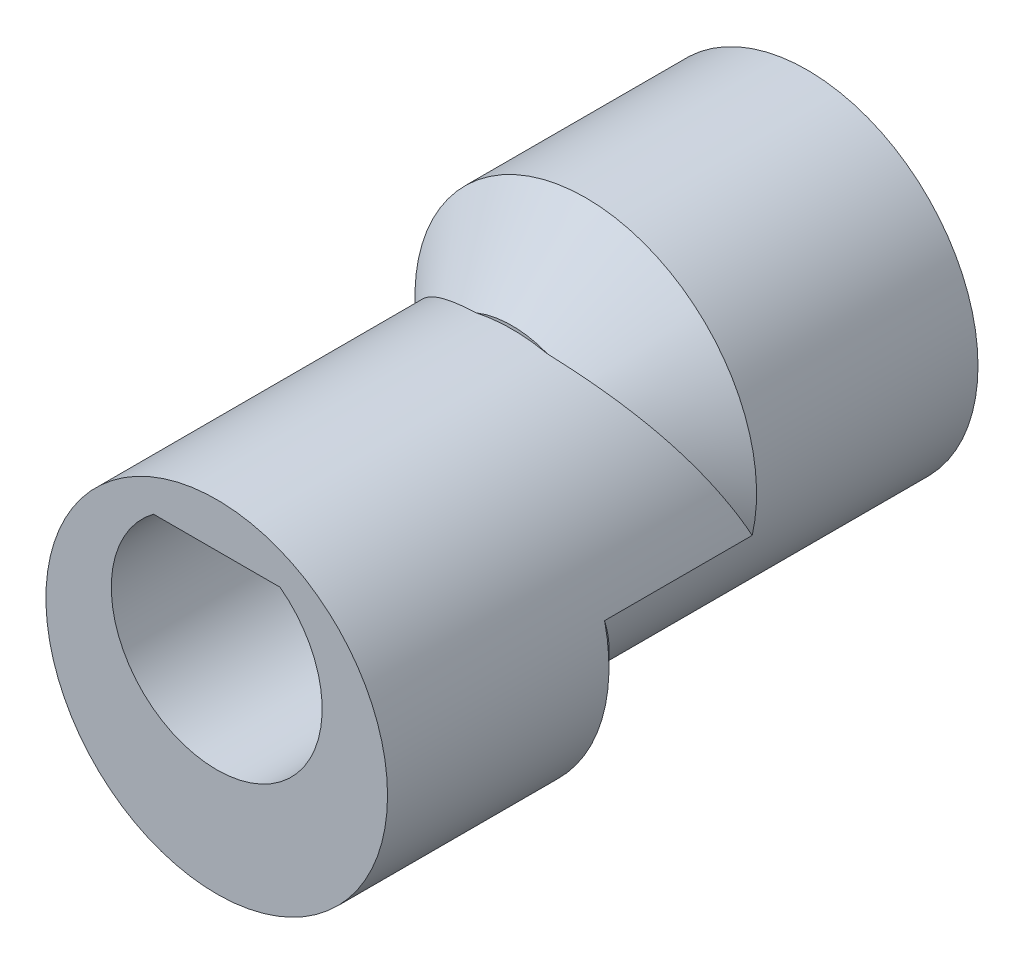
ISO-10303-21;
HEADER;
FILE_DESCRIPTION(('STEP AP214'),'2;1');
FILE_NAME('part.step','',(''),(''),'','','');
FILE_SCHEMA(('AUTOMOTIVE_DESIGN { 1 0 10303 214 1 1 1 1 }'));
ENDSEC;
DATA;
#1=APPLICATION_CONTEXT('core data for automotive mechanical design processes');
#2=APPLICATION_PROTOCOL_DEFINITION('international standard','automotive_design',2000,#1);
#3=PRODUCT_CONTEXT('',#1,'mechanical');
#4=PRODUCT('Part','Part','',(#3));
#5=PRODUCT_RELATED_PRODUCT_CATEGORY('part','',(#4));
#6=PRODUCT_DEFINITION_FORMATION('','',#4);
#7=PRODUCT_DEFINITION_CONTEXT('part definition',#1,'design');
#8=PRODUCT_DEFINITION('design','',#6,#7);
#9=PRODUCT_DEFINITION_SHAPE('','',#8);
#10=(LENGTH_UNIT() NAMED_UNIT(*) SI_UNIT(.MILLI.,.METRE.));
#11=(NAMED_UNIT(*) PLANE_ANGLE_UNIT() SI_UNIT($,.RADIAN.));
#12=(NAMED_UNIT(*) SI_UNIT($,.STERADIAN.) SOLID_ANGLE_UNIT());
#13=UNCERTAINTY_MEASURE_WITH_UNIT(LENGTH_MEASURE(1.E-05),#10,'distance_accuracy_value','');
#14=(GEOMETRIC_REPRESENTATION_CONTEXT(3) GLOBAL_UNCERTAINTY_ASSIGNED_CONTEXT((#13)) GLOBAL_UNIT_ASSIGNED_CONTEXT((#10,
#11,#12)) REPRESENTATION_CONTEXT('',''));
#15=CARTESIAN_POINT('',(0.,0.,0.));
#16=DIRECTION('',(0.,0.,1.));
#17=DIRECTION('',(1.,0.,0.));
#18=AXIS2_PLACEMENT_3D('',#15,#16,#17);
#19=CARTESIAN_POINT('',(0.,0.822072072072072,7.));
#20=DIRECTION('',(0.,0.,-1.));
#21=DIRECTION('',(-1.,0.,0.));
#22=AXIS2_PLACEMENT_3D('',#19,#20,#21);
#23=CYLINDRICAL_SURFACE('',#22,4.05);
#24=CARTESIAN_POINT('',(0.,0.822072072072072,7.));
#25=DIRECTION('',(0.,0.,1.));
#26=DIRECTION('',(1.,0.,0.));
#27=AXIS2_PLACEMENT_3D('',#24,#25,#26);
#28=CIRCLE('',#27,4.05);
#29=CARTESIAN_POINT('',(-0.846961969928471,-3.13837681934098,7.));
#30=VERTEX_POINT('',#29);
#31=CARTESIAN_POINT('',(0.846961969928471,-3.13837681934098,7.));
#32=VERTEX_POINT('',#31);
#33=EDGE_CURVE('E126',#30,#32,#28,.T.);
#34=ORIENTED_EDGE('',*,*,#33,.F.);
#35=CARTESIAN_POINT('',(-0.846961969928474,-3.13837681934098,7.));
#36=CARTESIAN_POINT('',(-0.944453761857588,-3.11753117747086,7.0165096973595));
#37=CARTESIAN_POINT('',(-1.04067496903015,-3.09318540551459,7.0356230191721));
#38=CARTESIAN_POINT('',(-1.23005837692651,-3.03787270431107,7.07838493619462));
#39=CARTESIAN_POINT('',(-1.32322355564702,-3.00691245596755,7.10202895274361));
#40=CARTESIAN_POINT('',(-1.59662952298076,-2.90498422423005,7.17852404267998));
#41=CARTESIAN_POINT('',(-1.77187682901298,-2.82472806223556,7.23713699648168));
#42=CARTESIAN_POINT('',(-2.11342415888718,-2.63848373698076,7.36760455331461));
#43=CARTESIAN_POINT('',(-2.27901457901958,-2.53153683436217,7.43992045799975));
#44=CARTESIAN_POINT('',(-2.59123932792963,-2.29661590900539,7.59193723018417));
#45=CARTESIAN_POINT('',(-2.73783425248497,-2.16859938915646,7.6716528781912));
#46=CARTESIAN_POINT('',(-3.03653680637737,-1.86775280591906,7.85116810696908));
#47=CARTESIAN_POINT('',(-3.18421083105399,-1.69104561302631,7.95186678230101));
#48=CARTESIAN_POINT('',(-3.44707875426469,-1.3162614680761,8.15549253682651));
#49=CARTESIAN_POINT('',(-3.56229295149296,-1.11819797878398,8.25841817982772));
#50=CARTESIAN_POINT('',(-3.72228939882795,-0.780496321625936,8.42649292580067));
#51=CARTESIAN_POINT('',(-3.77745627076403,-0.645751719150888,8.49179106287402));
#52=CARTESIAN_POINT('',(-3.87300271056816,-0.371020787102501,8.62159073903438));
#53=CARTESIAN_POINT('',(-3.91340419508013,-0.231042569178789,8.68609332033252));
#54=CARTESIAN_POINT('',(-3.94620239484035,-0.0889639639639639,8.75));
#55=B_SPLINE_CURVE_WITH_KNOTS('',3,(#35,#36,#37,#38,#39,#40,#41,#42,#43,#44,#45,#46,#47,#48,#49,
#50,#51,#52,#53,#54),.UNSPECIFIED.,.F.,.F.,(4,2,2,2,2,2,2,2,2,4),(0.,0.30292613976948,
0.605547745629666,1.20741367974593,1.83518085028585,2.46423009440399,3.21514113558015,
3.96558154828874,4.44358282871277,4.92087168989357),.UNSPECIFIED.);
#56=CARTESIAN_POINT('',(-3.94620239484035,-0.0889639639639638,8.75));
#57=VERTEX_POINT('',#56);
#58=EDGE_CURVE('E11',#30,#57,#55,.T.);
#59=ORIENTED_EDGE('',*,*,#58,.T.);
#60=DIRECTION('',(0.,0.,-1.));
#61=VECTOR('',#60,1.);
#62=CARTESIAN_POINT('',(-3.94620239484035,-0.0889639639639638,7.));
#63=LINE('',#62,#61);
#64=CARTESIAN_POINT('',(-3.94620239484035,-0.0889639639639638,5.24999999999999));
#65=VERTEX_POINT('',#64);
#66=EDGE_CURVE('E138',#57,#65,#63,.T.);
#67=ORIENTED_EDGE('',*,*,#66,.T.);
#68=CARTESIAN_POINT('',(0.,0.822072072072072,5.24999999999999));
#69=DIRECTION('',(0.,0.,1.));
#70=DIRECTION('',(1.,0.,0.));
#71=AXIS2_PLACEMENT_3D('',#68,#69,#70);
#72=CIRCLE('',#71,4.05);
#73=CARTESIAN_POINT('',(3.94620239484035,-0.0889639639639638,5.24999999999999));
#74=VERTEX_POINT('',#73);
#75=EDGE_CURVE('E135',#65,#74,#72,.F.);
#76=ORIENTED_EDGE('',*,*,#75,.T.);
#77=DIRECTION('',(0.,0.,-1.));
#78=VECTOR('',#77,1.);
#79=CARTESIAN_POINT('',(3.94620239484035,-0.0889639639639638,5.24999999999999));
#80=LINE('',#79,#78);
#81=CARTESIAN_POINT('',(3.94620239484035,-0.0889639639639638,8.75));
#82=VERTEX_POINT('',#81);
#83=EDGE_CURVE('E133',#74,#82,#80,.F.);
#84=ORIENTED_EDGE('',*,*,#83,.T.);
#85=CARTESIAN_POINT('',(3.94620239484035,-0.0889639639639638,8.75));
#86=CARTESIAN_POINT('',(3.91812605033587,-0.210607306567575,8.69528244226041));
#87=CARTESIAN_POINT('',(3.88445997758886,-0.330744710462108,8.64011544793179));
#88=CARTESIAN_POINT('',(3.80630891089535,-0.567172102265463,8.52921614752099));
#89=CARTESIAN_POINT('',(3.76182441909654,-0.683462268463122,8.47348386779211));
#90=CARTESIAN_POINT('',(3.6623194366343,-0.91154286556545,8.36169822857562));
#91=CARTESIAN_POINT('',(3.60728316507951,-1.0233262493251,8.30564451173022));
#92=CARTESIAN_POINT('',(3.48713755275824,-1.24139065274663,8.19371323094528));
#93=CARTESIAN_POINT('',(3.42202830416729,-1.34767172274707,8.13783566539859));
#94=CARTESIAN_POINT('',(3.21208932701072,-1.65726933886574,7.97103416554407));
#95=CARTESIAN_POINT('',(3.0526367211077,-1.85136693636232,7.86092834881628));
#96=CARTESIAN_POINT('',(2.69819145864416,-2.2086957237024,7.64774441488093));
#97=CARTESIAN_POINT('',(2.50321040419083,-2.37193695459476,7.54466401851965));
#98=CARTESIAN_POINT('',(2.20812286066361,-2.57457363242908,7.41036800619911));
#99=CARTESIAN_POINT('',(2.12116910311122,-2.62956959105757,7.37309937098474));
#100=CARTESIAN_POINT('',(1.94238404281531,-2.73324964625498,7.30146387089609));
#101=CARTESIAN_POINT('',(1.85055245067195,-2.78193336773062,7.2670971785068));
#102=CARTESIAN_POINT('',(1.66265498445166,-2.87237256972686,7.20208207231456));
#103=CARTESIAN_POINT('',(1.56660289270826,-2.91414874718689,7.17142262757191));
#104=CARTESIAN_POINT('',(1.37044860495057,-2.99046386166276,7.11450319150174));
#105=CARTESIAN_POINT('',(1.27034915161437,-3.02500760479873,7.08824028091645));
#106=CARTESIAN_POINT('',(1.11578965978391,-3.07158267863614,7.05235159124921));
#107=CARTESIAN_POINT('',(1.06260620121678,-3.08643556153087,7.04081151001587));
#108=CARTESIAN_POINT('',(0.955396604220098,-3.11401490955341,7.01924422815896));
#109=CARTESIAN_POINT('',(0.901370580301288,-3.12674166093135,7.00921682389491));
#110=CARTESIAN_POINT('',(0.846961969928479,-3.13837681934098,6.99999999999998));
#111=B_SPLINE_CURVE_WITH_KNOTS('',3,(#85,#86,#87,#88,#89,#90,#91,#92,#93,#94,#95,#96,#97,#98,
#99,#100,#101,#102,#103,#104,#105,#106,#107,#108,#109,#110),.UNSPECIFIED.,.F.,.F.,(4,2,2,2,2,2,
2,2,2,2,2,2,4),(0.,0.40877651524682,0.817534060345126,1.22690776683318,1.63627772745625,
2.45492321089459,3.27330183646774,3.60133482861724,3.92938730460955,4.25643829618268,
4.5832712601209,4.75244697157664,4.92159988779889),.UNSPECIFIED.);
#112=EDGE_CURVE('E50',#82,#32,#111,.T.);
#113=ORIENTED_EDGE('',*,*,#112,.T.);
#114=EDGE_LOOP('',(#34,#59,#67,#76,#84,#113));
#115=FACE_BOUND('',#114,.T.);
#116=CARTESIAN_POINT('',(0.,0.822072072072072,0.));
#117=DIRECTION('',(0.,0.,1.));
#118=DIRECTION('',(1.,0.,0.));
#119=AXIS2_PLACEMENT_3D('',#116,#117,#118);
#120=CIRCLE('',#119,4.05);
#121=CARTESIAN_POINT('',(4.05,0.822072072072072,0.));
#122=VERTEX_POINT('',#121);
#123=EDGE_CURVE('E123',#122,#122,#120,.T.);
#124=ORIENTED_EDGE('',*,*,#123,.T.);
#125=EDGE_LOOP('',(#124));
#126=FACE_BOUND('',#125,.T.);
#127=ADVANCED_FACE('F35',(#115,#126),#23,.T.);
#128=CARTESIAN_POINT('',(0.,0.822072072072072,7.));
#129=DIRECTION('',(0.,0.,1.));
#130=DIRECTION('',(1.,0.,0.));
#131=AXIS2_PLACEMENT_3D('',#128,#129,#130);
#132=PLANE('',#131);
#133=CARTESIAN_POINT('',(0.,-1.,7.));
#134=DIRECTION('',(0.,0.,1.));
#135=DIRECTION('',(1.,0.,0.));
#136=AXIS2_PLACEMENT_3D('',#133,#134,#135);
#137=CIRCLE('',#136,4.05);
#138=CARTESIAN_POINT('',(0.846961969928497,2.96044889141305,7.));
#139=VERTEX_POINT('',#138);
#140=CARTESIAN_POINT('',(-0.846961969928497,2.96044889141305,7.));
#141=VERTEX_POINT('',#140);
#142=EDGE_CURVE('E118',#139,#141,#137,.T.);
#143=ORIENTED_EDGE('',*,*,#142,.F.);
#144=CARTESIAN_POINT('',(0.,0.822072072072072,7.));
#145=DIRECTION('',(0.,0.,1.));
#146=DIRECTION('',(1.,0.,0.));
#147=AXIS2_PLACEMENT_3D('',#144,#145,#146);
#148=CIRCLE('',#147,2.3);
#149=EDGE_CURVE('E128',#139,#141,#148,.T.);
#150=ORIENTED_EDGE('',*,*,#149,.T.);
#151=EDGE_LOOP('',(#143,#150));
#152=FACE_BOUND('',#151,.T.);
#153=ADVANCED_FACE('F169',(#152),#132,.T.);
#154=CARTESIAN_POINT('',(0.,0.822072072072072,0.));
#155=DIRECTION('',(0.,0.,1.));
#156=DIRECTION('',(1.,0.,0.));
#157=AXIS2_PLACEMENT_3D('',#154,#155,#156);
#158=PLANE('',#157);
#159=DIRECTION('',(-1.,0.,0.));
#160=VECTOR('',#159,1.);
#161=CARTESIAN_POINT('',(-1.5,2.,0.));
#162=LINE('',#161,#160);
#163=CARTESIAN_POINT('',(1.5,2.,0.));
#164=VERTEX_POINT('',#163);
#165=CARTESIAN_POINT('',(-1.5,2.,0.));
#166=VERTEX_POINT('',#165);
#167=EDGE_CURVE('E105',#164,#166,#162,.T.);
#168=ORIENTED_EDGE('',*,*,#167,.T.);
#169=CARTESIAN_POINT('',(0.,0.,0.));
#170=DIRECTION('',(0.,0.,1.));
#171=DIRECTION('',(1.,0.,0.));
#172=AXIS2_PLACEMENT_3D('',#169,#170,#171);
#173=CIRCLE('',#172,2.5);
#174=EDGE_CURVE('E97',#166,#164,#173,.T.);
#175=ORIENTED_EDGE('',*,*,#174,.T.);
#176=EDGE_LOOP('',(#168,#175));
#177=FACE_BOUND('',#176,.T.);
#178=ORIENTED_EDGE('',*,*,#123,.F.);
#179=EDGE_LOOP('',(#178));
#180=FACE_BOUND('',#179,.T.);
#181=ADVANCED_FACE('F111',(#177,#180),#158,.F.);
#182=CARTESIAN_POINT('',(0.,-1.,7.));
#183=DIRECTION('',(0.,0.,1.));
#184=DIRECTION('',(1.,0.,0.));
#185=AXIS2_PLACEMENT_3D('',#182,#183,#184);
#186=PLANE('',#185);
#187=ORIENTED_EDGE('',*,*,#33,.T.);
#188=CARTESIAN_POINT('',(0.,-1.,7.));
#189=DIRECTION('',(0.,0.,1.));
#190=DIRECTION('',(1.,0.,0.));
#191=AXIS2_PLACEMENT_3D('',#188,#189,#190);
#192=CIRCLE('',#191,2.29999999999999);
#193=EDGE_CURVE('E62',#32,#30,#192,.F.);
#194=ORIENTED_EDGE('',*,*,#193,.T.);
#195=EDGE_LOOP('',(#187,#194));
#196=FACE_BOUND('',#195,.T.);
#197=ADVANCED_FACE('F224',(#196),#186,.F.);
#198=CARTESIAN_POINT('',(0.,-1.,14.));
#199=DIRECTION('',(0.,0.,-1.));
#200=DIRECTION('',(-1.,0.,0.));
#201=AXIS2_PLACEMENT_3D('',#198,#199,#200);
#202=CYLINDRICAL_SURFACE('',#201,4.05);
#203=CARTESIAN_POINT('',(0.,-1.,14.));
#204=DIRECTION('',(0.,0.,1.));
#205=DIRECTION('',(1.,0.,0.));
#206=AXIS2_PLACEMENT_3D('',#203,#204,#205);
#207=CIRCLE('',#206,4.05);
#208=CARTESIAN_POINT('',(4.05,-1.,14.));
#209=VERTEX_POINT('',#208);
#210=EDGE_CURVE('E120',#209,#209,#207,.T.);
#211=ORIENTED_EDGE('',*,*,#210,.F.);
#212=EDGE_LOOP('',(#211));
#213=FACE_BOUND('',#212,.T.);
#214=CARTESIAN_POINT('',(0.,-1.,8.75));
#215=DIRECTION('',(0.,0.,1.));
#216=DIRECTION('',(1.,0.,0.));
#217=AXIS2_PLACEMENT_3D('',#214,#215,#216);
#218=CIRCLE('',#217,4.05);
#219=EDGE_CURVE('E176',#57,#82,#218,.T.);
#220=ORIENTED_EDGE('',*,*,#219,.T.);
#221=ORIENTED_EDGE('',*,*,#83,.F.);
#222=CARTESIAN_POINT('',(3.94620239484035,-0.0889639639639638,5.24999999999999));
#223=CARTESIAN_POINT('',(3.91812605033587,0.0326793786396473,5.30471755773958));
#224=CARTESIAN_POINT('',(3.88445997758886,0.152816782534181,5.3598845520682));
#225=CARTESIAN_POINT('',(3.80630891089535,0.389244174337536,5.470783852479));
#226=CARTESIAN_POINT('',(3.76182441909654,0.505534340535195,5.52651613220789));
#227=CARTESIAN_POINT('',(3.6623194366343,0.733614937637524,5.63830177142438));
#228=CARTESIAN_POINT('',(3.60728316507951,0.84539832139717,5.69435548826977));
#229=CARTESIAN_POINT('',(3.48713755275824,1.0634627248187,5.80628676905472));
#230=CARTESIAN_POINT('',(3.42202830416729,1.16974379481914,5.86216433460141));
#231=CARTESIAN_POINT('',(3.21208932701072,1.47934141093782,6.02896583445593));
#232=CARTESIAN_POINT('',(3.0526367211077,1.6734390084344,6.13907165118372));
#233=CARTESIAN_POINT('',(2.69819145864415,2.03076779577447,6.35225558511907));
#234=CARTESIAN_POINT('',(2.50321040419083,2.19400902666683,6.45533598148035));
#235=CARTESIAN_POINT('',(2.20812286066361,2.39664570450116,6.58963199380089));
#236=CARTESIAN_POINT('',(2.12116910311121,2.45164166312965,6.62690062901526));
#237=CARTESIAN_POINT('',(1.94238404281531,2.55532171832706,6.69853612910391));
#238=CARTESIAN_POINT('',(1.85055245067195,2.6040054398027,6.7329028214932));
#239=CARTESIAN_POINT('',(1.66265498445165,2.69444464179894,6.79791792768544));
#240=CARTESIAN_POINT('',(1.56660289270826,2.73622081925896,6.8285773724281));
#241=CARTESIAN_POINT('',(1.37044860495057,2.81253593373483,6.88549680849827));
#242=CARTESIAN_POINT('',(1.27034915161436,2.8470796768708,6.91175971908355));
#243=CARTESIAN_POINT('',(1.11578965978391,2.89365475070822,6.9476484087508));
#244=CARTESIAN_POINT('',(1.06260620121678,2.90850763360294,6.95918848998413));
#245=CARTESIAN_POINT('',(0.95539660422011,2.93608698162548,6.98075577184104));
#246=CARTESIAN_POINT('',(0.901370580301304,2.94881373300342,6.99078317610509));
#247=CARTESIAN_POINT('',(0.846961969928499,2.96044889141305,7.00000000000002));
#248=B_SPLINE_CURVE_WITH_KNOTS('',3,(#222,#223,#224,#225,#226,#227,#228,#229,#230,#231,#232,
#233,#234,#235,#236,#237,#238,#239,#240,#241,#242,#243,#244,#245,#246,#247),.UNSPECIFIED.,.F.,
.F.,(4,2,2,2,2,2,2,2,2,2,2,2,4),(0.,0.408776515246821,0.817534060345128,1.22690776683319,
1.63627772745626,2.4549232108946,3.27330183646775,3.60133482861725,3.92938730460956,
4.2564382961827,4.58327126012091,4.75244697157664,4.92159988779887),.UNSPECIFIED.);
#249=EDGE_CURVE('E148',#74,#139,#248,.T.);
#250=ORIENTED_EDGE('',*,*,#249,.T.);
#251=ORIENTED_EDGE('',*,*,#142,.T.);
#252=CARTESIAN_POINT('',(-0.846961969928495,2.96044889141305,7.));
#253=CARTESIAN_POINT('',(-0.944453761857609,2.93960324954293,6.9834903026405));
#254=CARTESIAN_POINT('',(-1.04067496903017,2.91525747758665,6.9643769808279));
#255=CARTESIAN_POINT('',(-1.23005837692653,2.85994477638314,6.92161506380537));
#256=CARTESIAN_POINT('',(-1.32322355564704,2.82898452803962,6.89797104725639));
#257=CARTESIAN_POINT('',(-1.59662952298078,2.72705629630211,6.82147595732002));
#258=CARTESIAN_POINT('',(-1.771876829013,2.64680013430762,6.76286300351831));
#259=CARTESIAN_POINT('',(-2.1134241588872,2.46055580905282,6.63239544668538));
#260=CARTESIAN_POINT('',(-2.2790145790196,2.35360890643423,6.56007954200024));
#261=CARTESIAN_POINT('',(-2.59123932792964,2.11868798107745,6.40806276981582));
#262=CARTESIAN_POINT('',(-2.73783425248498,1.99067146122852,6.32834712180879));
#263=CARTESIAN_POINT('',(-3.03653680637739,1.68982487799112,6.14883189303091));
#264=CARTESIAN_POINT('',(-3.184210831054,1.51311768509836,6.04813321769897));
#265=CARTESIAN_POINT('',(-3.4470787542647,1.13833354014815,5.84450746317347));
#266=CARTESIAN_POINT('',(-3.56229295149297,0.940270050856031,5.74158182017227));
#267=CARTESIAN_POINT('',(-3.72228939882796,0.602568393697988,5.57350707419932));
#268=CARTESIAN_POINT('',(-3.77745627076404,0.467823791222944,5.50820893712597));
#269=CARTESIAN_POINT('',(-3.87300271056817,0.193092859174566,5.3784092609656));
#270=CARTESIAN_POINT('',(-3.91340419508013,0.0531146412508575,5.31390667966747));
#271=CARTESIAN_POINT('',(-3.94620239484035,-0.0889639639639634,5.24999999999999));
#272=B_SPLINE_CURVE_WITH_KNOTS('',3,(#252,#253,#254,#255,#256,#257,#258,#259,#260,#261,#262,
#263,#264,#265,#266,#267,#268,#269,#270,#271),.UNSPECIFIED.,.F.,.F.,(4,2,2,2,2,2,2,2,2,4),(0.,
0.302926139769481,0.605547745629667,1.20741367974594,1.83518085028586,2.464230094404,
3.21514113558016,3.96558154828875,4.44358282871276,4.92087168989356),.UNSPECIFIED.);
#273=EDGE_CURVE('E141',#141,#65,#272,.T.);
#274=ORIENTED_EDGE('',*,*,#273,.T.);
#275=ORIENTED_EDGE('',*,*,#66,.F.);
#276=EDGE_LOOP('',(#220,#221,#250,#251,#274,#275));
#277=FACE_BOUND('',#276,.T.);
#278=ADVANCED_FACE('F154',(#213,#277),#202,.T.);
#279=CARTESIAN_POINT('',(0.,-1.,14.));
#280=DIRECTION('',(0.,0.,1.));
#281=DIRECTION('',(1.,0.,0.));
#282=AXIS2_PLACEMENT_3D('',#279,#280,#281);
#283=PLANE('',#282);
#284=CARTESIAN_POINT('',(0.,0.,14.));
#285=DIRECTION('',(0.,0.,1.));
#286=DIRECTION('',(1.,0.,0.));
#287=AXIS2_PLACEMENT_3D('',#284,#285,#286);
#288=CIRCLE('',#287,2.5);
#289=CARTESIAN_POINT('',(-1.5,2.,14.));
#290=VERTEX_POINT('',#289);
#291=CARTESIAN_POINT('',(1.5,2.,14.));
#292=VERTEX_POINT('',#291);
#293=EDGE_CURVE('E100',#290,#292,#288,.T.);
#294=ORIENTED_EDGE('',*,*,#293,.F.);
#295=DIRECTION('',(-1.,0.,0.));
#296=VECTOR('',#295,1.);
#297=CARTESIAN_POINT('',(-1.5,2.,14.));
#298=LINE('',#297,#296);
#299=EDGE_CURVE('E113',#292,#290,#298,.T.);
#300=ORIENTED_EDGE('',*,*,#299,.F.);
#301=EDGE_LOOP('',(#294,#300));
#302=FACE_BOUND('',#301,.T.);
#303=ORIENTED_EDGE('',*,*,#210,.T.);
#304=EDGE_LOOP('',(#303));
#305=FACE_BOUND('',#304,.T.);
#306=ADVANCED_FACE('F210',(#302,#305),#283,.T.);
#307=CARTESIAN_POINT('',(0.,0.,0.));
#308=DIRECTION('',(0.,0.,1.));
#309=DIRECTION('',(1.,0.,0.));
#310=AXIS2_PLACEMENT_3D('',#307,#308,#309);
#311=CYLINDRICAL_SURFACE('',#310,2.5);
#312=ORIENTED_EDGE('',*,*,#293,.T.);
#313=DIRECTION('',(0.,0.,1.));
#314=VECTOR('',#313,1.);
#315=CARTESIAN_POINT('',(1.5,2.,0.));
#316=LINE('',#315,#314);
#317=EDGE_CURVE('E93',#164,#292,#316,.T.);
#318=ORIENTED_EDGE('',*,*,#317,.F.);
#319=ORIENTED_EDGE('',*,*,#174,.F.);
#320=DIRECTION('',(0.,0.,1.));
#321=VECTOR('',#320,1.);
#322=CARTESIAN_POINT('',(-1.5,2.,0.));
#323=LINE('',#322,#321);
#324=EDGE_CURVE('E104',#166,#290,#323,.T.);
#325=ORIENTED_EDGE('',*,*,#324,.T.);
#326=EDGE_LOOP('',(#312,#318,#319,#325));
#327=FACE_BOUND('',#326,.T.);
#328=ADVANCED_FACE('F95',(#327),#311,.F.);
#329=CARTESIAN_POINT('',(-1.5,2.,0.));
#330=DIRECTION('',(0.,1.,0.));
#331=DIRECTION('',(0.,0.,1.));
#332=AXIS2_PLACEMENT_3D('',#329,#330,#331);
#333=PLANE('',#332);
#334=ORIENTED_EDGE('',*,*,#299,.T.);
#335=ORIENTED_EDGE('',*,*,#324,.F.);
#336=ORIENTED_EDGE('',*,*,#167,.F.);
#337=ORIENTED_EDGE('',*,*,#317,.T.);
#338=EDGE_LOOP('',(#334,#335,#336,#337));
#339=FACE_BOUND('',#338,.T.);
#340=ADVANCED_FACE('F108',(#339),#333,.F.);
#341=CARTESIAN_POINT('',(0.,0.822072072072072,7.));
#342=DIRECTION('',(0.,0.,-1.));
#343=DIRECTION('',(-1.,0.,0.));
#344=AXIS2_PLACEMENT_3D('',#341,#342,#343);
#345=CONICAL_SURFACE('',#344,2.3,0.785398163397446);
#346=ORIENTED_EDGE('',*,*,#249,.F.);
#347=ORIENTED_EDGE('',*,*,#75,.F.);
#348=ORIENTED_EDGE('',*,*,#273,.F.);
#349=ORIENTED_EDGE('',*,*,#149,.F.);
#350=EDGE_LOOP('',(#346,#347,#348,#349));
#351=FACE_BOUND('',#350,.T.);
#352=ADVANCED_FACE('F159',(#351),#345,.T.);
#353=CARTESIAN_POINT('',(0.,-1.,8.75));
#354=DIRECTION('',(0.,0.,1.));
#355=DIRECTION('',(1.,0.,0.));
#356=AXIS2_PLACEMENT_3D('',#353,#354,#355);
#357=CONICAL_SURFACE('',#356,4.05,0.78539816339745);
#358=ORIENTED_EDGE('',*,*,#58,.F.);
#359=ORIENTED_EDGE('',*,*,#193,.F.);
#360=ORIENTED_EDGE('',*,*,#112,.F.);
#361=ORIENTED_EDGE('',*,*,#219,.F.);
#362=EDGE_LOOP('',(#358,#359,#360,#361));
#363=FACE_BOUND('',#362,.T.);
#364=ADVANCED_FACE('F38',(#363),#357,.T.);
#365=CLOSED_SHELL('',(#127,#153,#181,#197,#278,#306,#328,#340,#352,#364));
#366=MANIFOLD_SOLID_BREP('B2',#365);
#367=ADVANCED_BREP_SHAPE_REPRESENTATION('',(#18,#366),#14);
#368=SHAPE_DEFINITION_REPRESENTATION(#9,#367);
ENDSEC;
END-ISO-10303-21;
